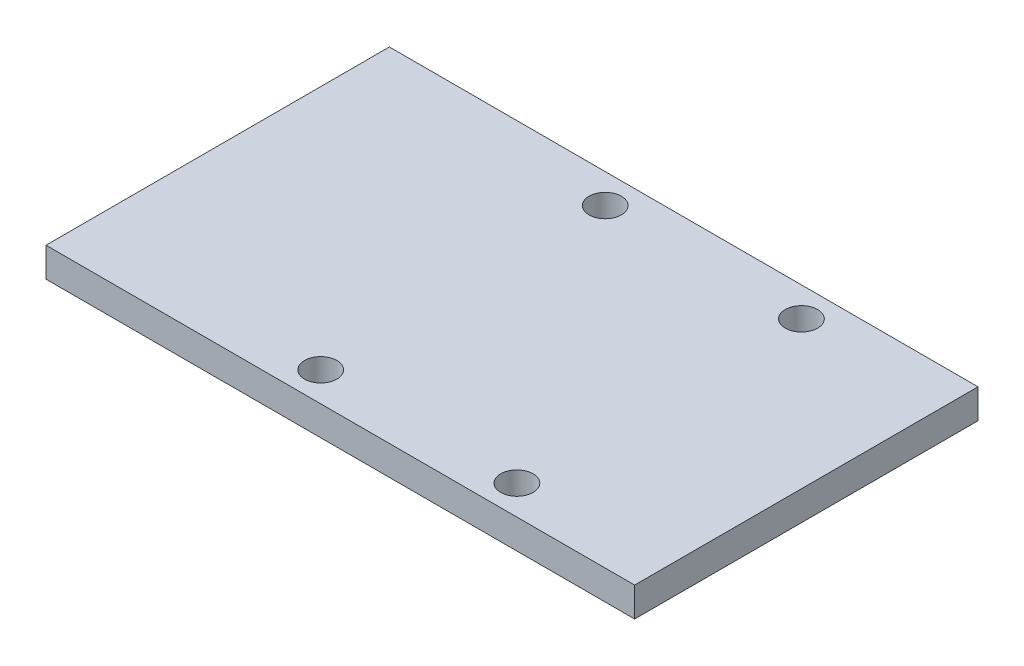
ISO-10303-21;
HEADER;
FILE_DESCRIPTION(('STEP AP214'),'2;1');
FILE_NAME('part.step','',(''),(''),'','','');
FILE_SCHEMA(('AUTOMOTIVE_DESIGN { 1 0 10303 214 1 1 1 1 }'));
ENDSEC;
DATA;
#1=APPLICATION_CONTEXT('core data for automotive mechanical design processes');
#2=APPLICATION_PROTOCOL_DEFINITION('international standard','automotive_design',2000,#1);
#3=PRODUCT_CONTEXT('',#1,'mechanical');
#4=PRODUCT('Part','Part','',(#3));
#5=PRODUCT_RELATED_PRODUCT_CATEGORY('part','',(#4));
#6=PRODUCT_DEFINITION_FORMATION('','',#4);
#7=PRODUCT_DEFINITION_CONTEXT('part definition',#1,'design');
#8=PRODUCT_DEFINITION('design','',#6,#7);
#9=PRODUCT_DEFINITION_SHAPE('','',#8);
#10=(LENGTH_UNIT() NAMED_UNIT(*) SI_UNIT(.MILLI.,.METRE.));
#11=(NAMED_UNIT(*) PLANE_ANGLE_UNIT() SI_UNIT($,.RADIAN.));
#12=(NAMED_UNIT(*) SI_UNIT($,.STERADIAN.) SOLID_ANGLE_UNIT());
#13=UNCERTAINTY_MEASURE_WITH_UNIT(LENGTH_MEASURE(1.E-05),#10,'distance_accuracy_value','');
#14=(GEOMETRIC_REPRESENTATION_CONTEXT(3) GLOBAL_UNCERTAINTY_ASSIGNED_CONTEXT((#13)) GLOBAL_UNIT_ASSIGNED_CONTEXT((#10,
#11,#12)) REPRESENTATION_CONTEXT('',''));
#15=CARTESIAN_POINT('',(0.,0.,0.));
#16=DIRECTION('',(0.,0.,1.));
#17=DIRECTION('',(1.,0.,0.));
#18=AXIS2_PLACEMENT_3D('',#15,#16,#17);
#19=CARTESIAN_POINT('',(30.,3.,17.5));
#20=DIRECTION('',(-1.,0.,0.));
#21=DIRECTION('',(0.,0.,1.));
#22=AXIS2_PLACEMENT_3D('',#19,#20,#21);
#23=PLANE('',#22);
#24=DIRECTION('',(0.,0.,-1.));
#25=VECTOR('',#24,1.);
#26=CARTESIAN_POINT('',(30.,0.,17.5));
#27=LINE('',#26,#25);
#28=CARTESIAN_POINT('',(30.,0.,17.5));
#29=VERTEX_POINT('',#28);
#30=CARTESIAN_POINT('',(30.,0.,-17.5));
#31=VERTEX_POINT('',#30);
#32=EDGE_CURVE('E103',#29,#31,#27,.T.);
#33=ORIENTED_EDGE('',*,*,#32,.T.);
#34=DIRECTION('',(0.,-1.,0.));
#35=VECTOR('',#34,1.);
#36=CARTESIAN_POINT('',(30.,3.,-17.5));
#37=LINE('',#36,#35);
#38=CARTESIAN_POINT('',(30.,3.,-17.5));
#39=VERTEX_POINT('',#38);
#40=EDGE_CURVE('E11',#39,#31,#37,.T.);
#41=ORIENTED_EDGE('',*,*,#40,.F.);
#42=DIRECTION('',(0.,0.,-1.));
#43=VECTOR('',#42,1.);
#44=CARTESIAN_POINT('',(30.,3.,17.5));
#45=LINE('',#44,#43);
#46=CARTESIAN_POINT('',(30.,3.,17.5));
#47=VERTEX_POINT('',#46);
#48=EDGE_CURVE('E91',#47,#39,#45,.T.);
#49=ORIENTED_EDGE('',*,*,#48,.F.);
#50=DIRECTION('',(0.,-1.,0.));
#51=VECTOR('',#50,1.);
#52=CARTESIAN_POINT('',(30.,3.,17.5));
#53=LINE('',#52,#51);
#54=EDGE_CURVE('E99',#47,#29,#53,.T.);
#55=ORIENTED_EDGE('',*,*,#54,.T.);
#56=EDGE_LOOP('',(#33,#41,#49,#55));
#57=FACE_BOUND('',#56,.T.);
#58=ADVANCED_FACE('F40',(#57),#23,.F.);
#59=CARTESIAN_POINT('',(-30.,3.,-17.5));
#60=DIRECTION('',(0.,0.,1.));
#61=DIRECTION('',(1.,0.,0.));
#62=AXIS2_PLACEMENT_3D('',#59,#60,#61);
#63=PLANE('',#62);
#64=DIRECTION('',(-1.,0.,0.));
#65=VECTOR('',#64,1.);
#66=CARTESIAN_POINT('',(-30.,0.,-17.5));
#67=LINE('',#66,#65);
#68=CARTESIAN_POINT('',(-30.,0.,-17.5));
#69=VERTEX_POINT('',#68);
#70=EDGE_CURVE('E95',#31,#69,#67,.T.);
#71=ORIENTED_EDGE('',*,*,#70,.T.);
#72=DIRECTION('',(0.,-1.,0.));
#73=VECTOR('',#72,1.);
#74=CARTESIAN_POINT('',(-30.,3.,-17.5));
#75=LINE('',#74,#73);
#76=CARTESIAN_POINT('',(-30.,3.,-17.5));
#77=VERTEX_POINT('',#76);
#78=EDGE_CURVE('E48',#77,#69,#75,.T.);
#79=ORIENTED_EDGE('',*,*,#78,.F.);
#80=DIRECTION('',(-1.,0.,0.));
#81=VECTOR('',#80,1.);
#82=CARTESIAN_POINT('',(-30.,3.,-17.5));
#83=LINE('',#82,#81);
#84=EDGE_CURVE('E86',#39,#77,#83,.T.);
#85=ORIENTED_EDGE('',*,*,#84,.F.);
#86=ORIENTED_EDGE('',*,*,#40,.T.);
#87=EDGE_LOOP('',(#71,#79,#85,#86));
#88=FACE_BOUND('',#87,.T.);
#89=ADVANCED_FACE('F94',(#88),#63,.F.);
#90=CARTESIAN_POINT('',(-30.,3.,17.5));
#91=DIRECTION('',(1.,0.,0.));
#92=DIRECTION('',(0.,0.,-1.));
#93=AXIS2_PLACEMENT_3D('',#90,#91,#92);
#94=PLANE('',#93);
#95=DIRECTION('',(0.,0.,1.));
#96=VECTOR('',#95,1.);
#97=CARTESIAN_POINT('',(-30.,0.,17.5));
#98=LINE('',#97,#96);
#99=CARTESIAN_POINT('',(-30.,0.,17.5));
#100=VERTEX_POINT('',#99);
#101=EDGE_CURVE('E73',#69,#100,#98,.T.);
#102=ORIENTED_EDGE('',*,*,#101,.T.);
#103=DIRECTION('',(0.,-1.,0.));
#104=VECTOR('',#103,1.);
#105=CARTESIAN_POINT('',(-30.,3.,17.5));
#106=LINE('',#105,#104);
#107=CARTESIAN_POINT('',(-30.,3.,17.5));
#108=VERTEX_POINT('',#107);
#109=EDGE_CURVE('E96',#108,#100,#106,.T.);
#110=ORIENTED_EDGE('',*,*,#109,.F.);
#111=DIRECTION('',(0.,0.,1.));
#112=VECTOR('',#111,1.);
#113=CARTESIAN_POINT('',(-30.,3.,17.5));
#114=LINE('',#113,#112);
#115=EDGE_CURVE('E89',#77,#108,#114,.T.);
#116=ORIENTED_EDGE('',*,*,#115,.F.);
#117=ORIENTED_EDGE('',*,*,#78,.T.);
#118=EDGE_LOOP('',(#102,#110,#116,#117));
#119=FACE_BOUND('',#118,.T.);
#120=ADVANCED_FACE('F97',(#119),#94,.F.);
#121=CARTESIAN_POINT('',(-30.,3.,17.5));
#122=DIRECTION('',(0.,0.,-1.));
#123=DIRECTION('',(-1.,0.,0.));
#124=AXIS2_PLACEMENT_3D('',#121,#122,#123);
#125=PLANE('',#124);
#126=DIRECTION('',(1.,0.,0.));
#127=VECTOR('',#126,1.);
#128=CARTESIAN_POINT('',(-30.,0.,17.5));
#129=LINE('',#128,#127);
#130=EDGE_CURVE('E79',#100,#29,#129,.T.);
#131=ORIENTED_EDGE('',*,*,#130,.T.);
#132=ORIENTED_EDGE('',*,*,#54,.F.);
#133=DIRECTION('',(1.,0.,0.));
#134=VECTOR('',#133,1.);
#135=CARTESIAN_POINT('',(-30.,3.,17.5));
#136=LINE('',#135,#134);
#137=EDGE_CURVE('E56',#108,#47,#136,.T.);
#138=ORIENTED_EDGE('',*,*,#137,.F.);
#139=ORIENTED_EDGE('',*,*,#109,.T.);
#140=EDGE_LOOP('',(#131,#132,#138,#139));
#141=FACE_BOUND('',#140,.T.);
#142=ADVANCED_FACE('F111',(#141),#125,.F.);
#143=CARTESIAN_POINT('',(0.,3.,0.));
#144=DIRECTION('',(0.,-1.,0.));
#145=DIRECTION('',(0.,0.,-1.));
#146=AXIS2_PLACEMENT_3D('',#143,#144,#145);
#147=PLANE('',#146);
#148=CARTESIAN_POINT('',(15.,3.,-14.5));
#149=DIRECTION('',(0.,-1.,0.));
#150=DIRECTION('',(0.,0.,-1.));
#151=AXIS2_PLACEMENT_3D('',#148,#149,#150);
#152=CIRCLE('',#151,1.65);
#153=CARTESIAN_POINT('',(15.,3.,-16.15));
#154=VERTEX_POINT('',#153);
#155=EDGE_CURVE('E123',#154,#154,#152,.T.);
#156=ORIENTED_EDGE('',*,*,#155,.T.);
#157=EDGE_LOOP('',(#156));
#158=FACE_BOUND('',#157,.T.);
#159=CARTESIAN_POINT('',(-5.00000000000001,3.,-14.5));
#160=DIRECTION('',(0.,-1.,0.));
#161=DIRECTION('',(0.,0.,-1.));
#162=AXIS2_PLACEMENT_3D('',#159,#160,#161);
#163=CIRCLE('',#162,1.65);
#164=CARTESIAN_POINT('',(-5.00000000000001,3.,-16.15));
#165=VERTEX_POINT('',#164);
#166=EDGE_CURVE('E129',#165,#165,#163,.T.);
#167=ORIENTED_EDGE('',*,*,#166,.T.);
#168=EDGE_LOOP('',(#167));
#169=FACE_BOUND('',#168,.T.);
#170=CARTESIAN_POINT('',(-5.00000000000001,3.,14.5));
#171=DIRECTION('',(0.,-1.,0.));
#172=DIRECTION('',(0.,0.,-1.));
#173=AXIS2_PLACEMENT_3D('',#170,#171,#172);
#174=CIRCLE('',#173,1.65);
#175=CARTESIAN_POINT('',(-5.00000000000001,3.,12.85));
#176=VERTEX_POINT('',#175);
#177=EDGE_CURVE('E135',#176,#176,#174,.T.);
#178=ORIENTED_EDGE('',*,*,#177,.T.);
#179=EDGE_LOOP('',(#178));
#180=FACE_BOUND('',#179,.T.);
#181=CARTESIAN_POINT('',(15.,3.,14.5));
#182=DIRECTION('',(0.,-1.,0.));
#183=DIRECTION('',(0.,0.,-1.));
#184=AXIS2_PLACEMENT_3D('',#181,#182,#183);
#185=CIRCLE('',#184,1.65);
#186=CARTESIAN_POINT('',(15.,3.,12.85));
#187=VERTEX_POINT('',#186);
#188=EDGE_CURVE('E106',#187,#187,#185,.T.);
#189=ORIENTED_EDGE('',*,*,#188,.T.);
#190=EDGE_LOOP('',(#189));
#191=FACE_BOUND('',#190,.T.);
#192=ORIENTED_EDGE('',*,*,#48,.T.);
#193=ORIENTED_EDGE('',*,*,#84,.T.);
#194=ORIENTED_EDGE('',*,*,#115,.T.);
#195=ORIENTED_EDGE('',*,*,#137,.T.);
#196=EDGE_LOOP('',(#192,#193,#194,#195));
#197=FACE_BOUND('',#196,.T.);
#198=ADVANCED_FACE('F87',(#158,#169,#180,#191,#197),#147,.F.);
#199=CARTESIAN_POINT('',(0.,0.,0.));
#200=DIRECTION('',(0.,-1.,0.));
#201=DIRECTION('',(0.,0.,-1.));
#202=AXIS2_PLACEMENT_3D('',#199,#200,#201);
#203=PLANE('',#202);
#204=CARTESIAN_POINT('',(15.,0.,-14.5));
#205=DIRECTION('',(0.,-1.,0.));
#206=DIRECTION('',(0.,0.,-1.));
#207=AXIS2_PLACEMENT_3D('',#204,#205,#206);
#208=CIRCLE('',#207,1.65);
#209=CARTESIAN_POINT('',(15.,0.,-16.15));
#210=VERTEX_POINT('',#209);
#211=EDGE_CURVE('E126',#210,#210,#208,.T.);
#212=ORIENTED_EDGE('',*,*,#211,.F.);
#213=EDGE_LOOP('',(#212));
#214=FACE_BOUND('',#213,.T.);
#215=CARTESIAN_POINT('',(-5.00000000000001,0.,-14.5));
#216=DIRECTION('',(0.,-1.,0.));
#217=DIRECTION('',(0.,0.,-1.));
#218=AXIS2_PLACEMENT_3D('',#215,#216,#217);
#219=CIRCLE('',#218,1.65);
#220=CARTESIAN_POINT('',(-5.00000000000001,0.,-16.15));
#221=VERTEX_POINT('',#220);
#222=EDGE_CURVE('E132',#221,#221,#219,.T.);
#223=ORIENTED_EDGE('',*,*,#222,.F.);
#224=EDGE_LOOP('',(#223));
#225=FACE_BOUND('',#224,.T.);
#226=CARTESIAN_POINT('',(-5.00000000000001,0.,14.5));
#227=DIRECTION('',(0.,-1.,0.));
#228=DIRECTION('',(0.,0.,-1.));
#229=AXIS2_PLACEMENT_3D('',#226,#227,#228);
#230=CIRCLE('',#229,1.65);
#231=CARTESIAN_POINT('',(-5.00000000000001,0.,12.85));
#232=VERTEX_POINT('',#231);
#233=EDGE_CURVE('E120',#232,#232,#230,.T.);
#234=ORIENTED_EDGE('',*,*,#233,.F.);
#235=EDGE_LOOP('',(#234));
#236=FACE_BOUND('',#235,.T.);
#237=CARTESIAN_POINT('',(15.,0.,14.5));
#238=DIRECTION('',(0.,-1.,0.));
#239=DIRECTION('',(0.,0.,-1.));
#240=AXIS2_PLACEMENT_3D('',#237,#238,#239);
#241=CIRCLE('',#240,1.65);
#242=CARTESIAN_POINT('',(15.,0.,12.85));
#243=VERTEX_POINT('',#242);
#244=EDGE_CURVE('E117',#243,#243,#241,.T.);
#245=ORIENTED_EDGE('',*,*,#244,.F.);
#246=EDGE_LOOP('',(#245));
#247=FACE_BOUND('',#246,.T.);
#248=ORIENTED_EDGE('',*,*,#32,.F.);
#249=ORIENTED_EDGE('',*,*,#130,.F.);
#250=ORIENTED_EDGE('',*,*,#101,.F.);
#251=ORIENTED_EDGE('',*,*,#70,.F.);
#252=EDGE_LOOP('',(#248,#249,#250,#251));
#253=FACE_BOUND('',#252,.T.);
#254=ADVANCED_FACE('F114',(#214,#225,#236,#247,#253),#203,.T.);
#255=CARTESIAN_POINT('',(15.,3.,14.5));
#256=DIRECTION('',(0.,-1.,0.));
#257=DIRECTION('',(0.,0.,-1.));
#258=AXIS2_PLACEMENT_3D('',#255,#256,#257);
#259=CYLINDRICAL_SURFACE('',#258,1.65);
#260=ORIENTED_EDGE('',*,*,#188,.F.);
#261=EDGE_LOOP('',(#260));
#262=FACE_BOUND('',#261,.T.);
#263=ORIENTED_EDGE('',*,*,#244,.T.);
#264=EDGE_LOOP('',(#263));
#265=FACE_BOUND('',#264,.T.);
#266=ADVANCED_FACE('F145',(#262,#265),#259,.F.);
#267=CARTESIAN_POINT('',(-5.00000000000001,3.,14.5));
#268=DIRECTION('',(0.,-1.,0.));
#269=DIRECTION('',(0.,0.,-1.));
#270=AXIS2_PLACEMENT_3D('',#267,#268,#269);
#271=CYLINDRICAL_SURFACE('',#270,1.65);
#272=ORIENTED_EDGE('',*,*,#177,.F.);
#273=EDGE_LOOP('',(#272));
#274=FACE_BOUND('',#273,.T.);
#275=ORIENTED_EDGE('',*,*,#233,.T.);
#276=EDGE_LOOP('',(#275));
#277=FACE_BOUND('',#276,.T.);
#278=ADVANCED_FACE('F141',(#274,#277),#271,.F.);
#279=CARTESIAN_POINT('',(-5.00000000000001,3.,-14.5));
#280=DIRECTION('',(0.,-1.,0.));
#281=DIRECTION('',(0.,0.,-1.));
#282=AXIS2_PLACEMENT_3D('',#279,#280,#281);
#283=CYLINDRICAL_SURFACE('',#282,1.65);
#284=ORIENTED_EDGE('',*,*,#166,.F.);
#285=EDGE_LOOP('',(#284));
#286=FACE_BOUND('',#285,.T.);
#287=ORIENTED_EDGE('',*,*,#222,.T.);
#288=EDGE_LOOP('',(#287));
#289=FACE_BOUND('',#288,.T.);
#290=ADVANCED_FACE('F156',(#286,#289),#283,.F.);
#291=CARTESIAN_POINT('',(15.,3.,-14.5));
#292=DIRECTION('',(0.,-1.,0.));
#293=DIRECTION('',(0.,0.,-1.));
#294=AXIS2_PLACEMENT_3D('',#291,#292,#293);
#295=CYLINDRICAL_SURFACE('',#294,1.65);
#296=ORIENTED_EDGE('',*,*,#155,.F.);
#297=EDGE_LOOP('',(#296));
#298=FACE_BOUND('',#297,.T.);
#299=ORIENTED_EDGE('',*,*,#211,.T.);
#300=EDGE_LOOP('',(#299));
#301=FACE_BOUND('',#300,.T.);
#302=ADVANCED_FACE('F185',(#298,#301),#295,.F.);
#303=CLOSED_SHELL('',(#58,#89,#120,#142,#198,#254,#266,#278,#290,#302));
#304=MANIFOLD_SOLID_BREP('B2',#303);
#305=ADVANCED_BREP_SHAPE_REPRESENTATION('',(#18,#304),#14);
#306=SHAPE_DEFINITION_REPRESENTATION(#9,#305);
ENDSEC;
END-ISO-10303-21;
